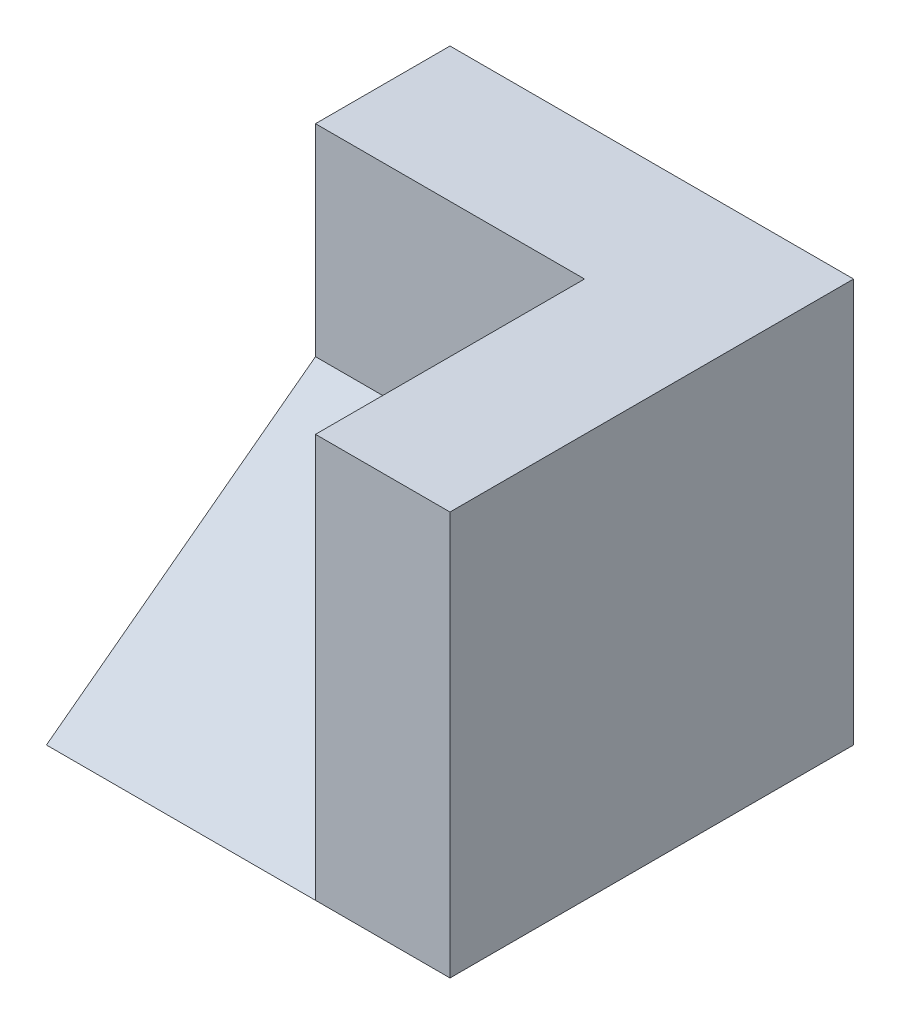
ISO-10303-21;
HEADER;
FILE_DESCRIPTION(('STEP AP214'),'2;1');
FILE_NAME('part.step','',(''),(''),'','','');
FILE_SCHEMA(('AUTOMOTIVE_DESIGN { 1 0 10303 214 1 1 1 1 }'));
ENDSEC;
DATA;
#1=APPLICATION_CONTEXT('core data for automotive mechanical design processes');
#2=APPLICATION_PROTOCOL_DEFINITION('international standard','automotive_design',2000,#1);
#3=PRODUCT_CONTEXT('',#1,'mechanical');
#4=PRODUCT('Part','Part','',(#3));
#5=PRODUCT_RELATED_PRODUCT_CATEGORY('part','',(#4));
#6=PRODUCT_DEFINITION_FORMATION('','',#4);
#7=PRODUCT_DEFINITION_CONTEXT('part definition',#1,'design');
#8=PRODUCT_DEFINITION('design','',#6,#7);
#9=PRODUCT_DEFINITION_SHAPE('','',#8);
#10=(LENGTH_UNIT() NAMED_UNIT(*) SI_UNIT(.MILLI.,.METRE.));
#11=(NAMED_UNIT(*) PLANE_ANGLE_UNIT() SI_UNIT($,.RADIAN.));
#12=(NAMED_UNIT(*) SI_UNIT($,.STERADIAN.) SOLID_ANGLE_UNIT());
#13=UNCERTAINTY_MEASURE_WITH_UNIT(LENGTH_MEASURE(1.E-05),#10,'distance_accuracy_value','');
#14=(GEOMETRIC_REPRESENTATION_CONTEXT(3) GLOBAL_UNCERTAINTY_ASSIGNED_CONTEXT((#13)) GLOBAL_UNIT_ASSIGNED_CONTEXT((#10,
#11,#12)) REPRESENTATION_CONTEXT('',''));
#15=CARTESIAN_POINT('',(0.,0.,0.));
#16=DIRECTION('',(0.,0.,1.));
#17=DIRECTION('',(1.,0.,0.));
#18=AXIS2_PLACEMENT_3D('',#15,#16,#17);
#19=CARTESIAN_POINT('',(0.,0.,-40.));
#20=DIRECTION('',(0.,0.,-1.));
#21=DIRECTION('',(-1.,0.,0.));
#22=AXIS2_PLACEMENT_3D('',#19,#20,#21);
#23=PLANE('',#22);
#24=DIRECTION('',(1.,0.,0.));
#25=VECTOR('',#24,1.);
#26=CARTESIAN_POINT('',(0.,30.,-40.));
#27=LINE('',#26,#25);
#28=CARTESIAN_POINT('',(0.,30.,-40.));
#29=VERTEX_POINT('',#28);
#30=CARTESIAN_POINT('',(40.,30.,-40.));
#31=VERTEX_POINT('',#30);
#32=EDGE_CURVE('E113',#29,#31,#27,.T.);
#33=ORIENTED_EDGE('',*,*,#32,.T.);
#34=DIRECTION('',(0.,1.,0.));
#35=VECTOR('',#34,1.);
#36=CARTESIAN_POINT('',(40.,0.,-40.));
#37=LINE('',#36,#35);
#38=CARTESIAN_POINT('',(40.,60.,-40.));
#39=VERTEX_POINT('',#38);
#40=EDGE_CURVE('E126',#31,#39,#37,.T.);
#41=ORIENTED_EDGE('',*,*,#40,.T.);
#42=DIRECTION('',(-1.,0.,0.));
#43=VECTOR('',#42,1.);
#44=CARTESIAN_POINT('',(0.,60.,-40.));
#45=LINE('',#44,#43);
#46=CARTESIAN_POINT('',(0.,60.,-40.));
#47=VERTEX_POINT('',#46);
#48=EDGE_CURVE('E122',#39,#47,#45,.T.);
#49=ORIENTED_EDGE('',*,*,#48,.T.);
#50=DIRECTION('',(0.,1.,0.));
#51=VECTOR('',#50,1.);
#52=CARTESIAN_POINT('',(0.,0.,-40.));
#53=LINE('',#52,#51);
#54=EDGE_CURVE('E53',#29,#47,#53,.T.);
#55=ORIENTED_EDGE('',*,*,#54,.F.);
#56=EDGE_LOOP('',(#33,#41,#49,#55));
#57=FACE_BOUND('',#56,.T.);
#58=ADVANCED_FACE('F36',(#57),#23,.F.);
#59=CARTESIAN_POINT('',(40.,0.,-40.));
#60=DIRECTION('',(1.,0.,0.));
#61=DIRECTION('',(0.,0.,-1.));
#62=AXIS2_PLACEMENT_3D('',#59,#60,#61);
#63=PLANE('',#62);
#64=DIRECTION('',(0.,0.6,-0.8));
#65=VECTOR('',#64,1.);
#66=CARTESIAN_POINT('',(40.,30.,-40.));
#67=LINE('',#66,#65);
#68=CARTESIAN_POINT('',(40.,0.,0.));
#69=VERTEX_POINT('',#68);
#70=EDGE_CURVE('E61',#69,#31,#67,.T.);
#71=ORIENTED_EDGE('',*,*,#70,.F.);
#72=DIRECTION('',(0.,1.,0.));
#73=VECTOR('',#72,1.);
#74=CARTESIAN_POINT('',(40.,0.,0.));
#75=LINE('',#74,#73);
#76=CARTESIAN_POINT('',(40.,60.,0.));
#77=VERTEX_POINT('',#76);
#78=EDGE_CURVE('E124',#69,#77,#75,.T.);
#79=ORIENTED_EDGE('',*,*,#78,.T.);
#80=DIRECTION('',(0.,0.,-1.));
#81=VECTOR('',#80,1.);
#82=CARTESIAN_POINT('',(40.,60.,-40.));
#83=LINE('',#82,#81);
#84=EDGE_CURVE('E112',#77,#39,#83,.T.);
#85=ORIENTED_EDGE('',*,*,#84,.T.);
#86=ORIENTED_EDGE('',*,*,#40,.F.);
#87=EDGE_LOOP('',(#71,#79,#85,#86));
#88=FACE_BOUND('',#87,.T.);
#89=ADVANCED_FACE('F155',(#88),#63,.F.);
#90=CARTESIAN_POINT('',(0.,60.,-60.));
#91=DIRECTION('',(-1.,0.,0.));
#92=DIRECTION('',(0.,0.,1.));
#93=AXIS2_PLACEMENT_3D('',#90,#91,#92);
#94=PLANE('',#93);
#95=DIRECTION('',(0.,0.,1.));
#96=VECTOR('',#95,1.);
#97=CARTESIAN_POINT('',(0.,0.,-60.));
#98=LINE('',#97,#96);
#99=CARTESIAN_POINT('',(0.,0.,-60.));
#100=VERTEX_POINT('',#99);
#101=CARTESIAN_POINT('',(0.,0.,0.));
#102=VERTEX_POINT('',#101);
#103=EDGE_CURVE('E40',#100,#102,#98,.T.);
#104=ORIENTED_EDGE('',*,*,#103,.T.);
#105=DIRECTION('',(0.,0.6,-0.8));
#106=VECTOR('',#105,1.);
#107=CARTESIAN_POINT('',(0.,30.,-40.));
#108=LINE('',#107,#106);
#109=EDGE_CURVE('E96',#102,#29,#108,.T.);
#110=ORIENTED_EDGE('',*,*,#109,.T.);
#111=ORIENTED_EDGE('',*,*,#54,.T.);
#112=DIRECTION('',(0.,0.,1.));
#113=VECTOR('',#112,1.);
#114=CARTESIAN_POINT('',(0.,60.,-60.));
#115=LINE('',#114,#113);
#116=CARTESIAN_POINT('',(0.,60.,-60.));
#117=VERTEX_POINT('',#116);
#118=EDGE_CURVE('E11',#117,#47,#115,.T.);
#119=ORIENTED_EDGE('',*,*,#118,.F.);
#120=DIRECTION('',(0.,-1.,0.));
#121=VECTOR('',#120,1.);
#122=CARTESIAN_POINT('',(0.,60.,-60.));
#123=LINE('',#122,#121);
#124=EDGE_CURVE('E99',#117,#100,#123,.T.);
#125=ORIENTED_EDGE('',*,*,#124,.T.);
#126=EDGE_LOOP('',(#104,#110,#111,#119,#125));
#127=FACE_BOUND('',#126,.T.);
#128=ADVANCED_FACE('F38',(#127),#94,.T.);
#129=CARTESIAN_POINT('',(60.,60.,-60.));
#130=DIRECTION('',(0.,1.,0.));
#131=DIRECTION('',(-1.,0.,0.));
#132=AXIS2_PLACEMENT_3D('',#129,#130,#131);
#133=PLANE('',#132);
#134=ORIENTED_EDGE('',*,*,#48,.F.);
#135=ORIENTED_EDGE('',*,*,#84,.F.);
#136=DIRECTION('',(-1.,0.,0.));
#137=VECTOR('',#136,1.);
#138=CARTESIAN_POINT('',(60.,60.,0.));
#139=LINE('',#138,#137);
#140=CARTESIAN_POINT('',(60.,60.,0.));
#141=VERTEX_POINT('',#140);
#142=EDGE_CURVE('E131',#141,#77,#139,.T.);
#143=ORIENTED_EDGE('',*,*,#142,.F.);
#144=DIRECTION('',(0.,0.,1.));
#145=VECTOR('',#144,1.);
#146=CARTESIAN_POINT('',(60.,60.,-60.));
#147=LINE('',#146,#145);
#148=CARTESIAN_POINT('',(60.,60.,-60.));
#149=VERTEX_POINT('',#148);
#150=EDGE_CURVE('E45',#149,#141,#147,.T.);
#151=ORIENTED_EDGE('',*,*,#150,.F.);
#152=DIRECTION('',(-1.,0.,0.));
#153=VECTOR('',#152,1.);
#154=CARTESIAN_POINT('',(60.,60.,-60.));
#155=LINE('',#154,#153);
#156=EDGE_CURVE('E104',#149,#117,#155,.T.);
#157=ORIENTED_EDGE('',*,*,#156,.T.);
#158=ORIENTED_EDGE('',*,*,#118,.T.);
#159=EDGE_LOOP('',(#134,#135,#143,#151,#157,#158));
#160=FACE_BOUND('',#159,.T.);
#161=ADVANCED_FACE('F154',(#160),#133,.T.);
#162=CARTESIAN_POINT('',(60.,0.,-60.));
#163=DIRECTION('',(1.,0.,0.));
#164=DIRECTION('',(0.,1.,0.));
#165=AXIS2_PLACEMENT_3D('',#162,#163,#164);
#166=PLANE('',#165);
#167=DIRECTION('',(0.,1.,0.));
#168=VECTOR('',#167,1.);
#169=CARTESIAN_POINT('',(60.,0.,0.));
#170=LINE('',#169,#168);
#171=CARTESIAN_POINT('',(60.,0.,0.));
#172=VERTEX_POINT('',#171);
#173=EDGE_CURVE('E139',#172,#141,#170,.T.);
#174=ORIENTED_EDGE('',*,*,#173,.F.);
#175=DIRECTION('',(0.,0.,1.));
#176=VECTOR('',#175,1.);
#177=CARTESIAN_POINT('',(60.,0.,-60.));
#178=LINE('',#177,#176);
#179=CARTESIAN_POINT('',(60.,0.,-60.));
#180=VERTEX_POINT('',#179);
#181=EDGE_CURVE('E103',#180,#172,#178,.T.);
#182=ORIENTED_EDGE('',*,*,#181,.F.);
#183=DIRECTION('',(0.,1.,0.));
#184=VECTOR('',#183,1.);
#185=CARTESIAN_POINT('',(60.,0.,-60.));
#186=LINE('',#185,#184);
#187=EDGE_CURVE('E133',#180,#149,#186,.T.);
#188=ORIENTED_EDGE('',*,*,#187,.T.);
#189=ORIENTED_EDGE('',*,*,#150,.T.);
#190=EDGE_LOOP('',(#174,#182,#188,#189));
#191=FACE_BOUND('',#190,.T.);
#192=ADVANCED_FACE('F147',(#191),#166,.T.);
#193=CARTESIAN_POINT('',(0.,0.,-60.));
#194=DIRECTION('',(0.,-1.,0.));
#195=DIRECTION('',(0.,0.,-1.));
#196=AXIS2_PLACEMENT_3D('',#193,#194,#195);
#197=PLANE('',#196);
#198=DIRECTION('',(1.,0.,0.));
#199=VECTOR('',#198,1.);
#200=CARTESIAN_POINT('',(0.,0.,0.));
#201=LINE('',#200,#199);
#202=EDGE_CURVE('E107',#102,#69,#201,.T.);
#203=ORIENTED_EDGE('',*,*,#202,.F.);
#204=ORIENTED_EDGE('',*,*,#103,.F.);
#205=DIRECTION('',(1.,0.,0.));
#206=VECTOR('',#205,1.);
#207=CARTESIAN_POINT('',(0.,0.,-60.));
#208=LINE('',#207,#206);
#209=EDGE_CURVE('E130',#100,#180,#208,.T.);
#210=ORIENTED_EDGE('',*,*,#209,.T.);
#211=ORIENTED_EDGE('',*,*,#181,.T.);
#212=DIRECTION('',(1.,0.,0.));
#213=VECTOR('',#212,1.);
#214=CARTESIAN_POINT('',(0.,0.,0.));
#215=LINE('',#214,#213);
#216=EDGE_CURVE('E110',#69,#172,#215,.T.);
#217=ORIENTED_EDGE('',*,*,#216,.F.);
#218=EDGE_LOOP('',(#203,#204,#210,#211,#217));
#219=FACE_BOUND('',#218,.T.);
#220=ADVANCED_FACE('F108',(#219),#197,.T.);
#221=CARTESIAN_POINT('',(0.,0.,-60.));
#222=DIRECTION('',(0.,0.,1.));
#223=DIRECTION('',(1.,0.,0.));
#224=AXIS2_PLACEMENT_3D('',#221,#222,#223);
#225=PLANE('',#224);
#226=ORIENTED_EDGE('',*,*,#124,.F.);
#227=ORIENTED_EDGE('',*,*,#156,.F.);
#228=ORIENTED_EDGE('',*,*,#187,.F.);
#229=ORIENTED_EDGE('',*,*,#209,.F.);
#230=EDGE_LOOP('',(#226,#227,#228,#229));
#231=FACE_BOUND('',#230,.T.);
#232=ADVANCED_FACE('F164',(#231),#225,.F.);
#233=CARTESIAN_POINT('',(0.,0.,0.));
#234=DIRECTION('',(0.,0.,1.));
#235=DIRECTION('',(1.,0.,0.));
#236=AXIS2_PLACEMENT_3D('',#233,#234,#235);
#237=PLANE('',#236);
#238=ORIENTED_EDGE('',*,*,#78,.F.);
#239=ORIENTED_EDGE('',*,*,#216,.T.);
#240=ORIENTED_EDGE('',*,*,#173,.T.);
#241=ORIENTED_EDGE('',*,*,#142,.T.);
#242=EDGE_LOOP('',(#238,#239,#240,#241));
#243=FACE_BOUND('',#242,.T.);
#244=ADVANCED_FACE('F150',(#243),#237,.T.);
#245=CARTESIAN_POINT('',(0.,30.,-40.));
#246=DIRECTION('',(0.,-0.8,-0.6));
#247=DIRECTION('',(0.,0.6,-0.8));
#248=AXIS2_PLACEMENT_3D('',#245,#246,#247);
#249=PLANE('',#248);
#250=ORIENTED_EDGE('',*,*,#70,.T.);
#251=ORIENTED_EDGE('',*,*,#32,.F.);
#252=ORIENTED_EDGE('',*,*,#109,.F.);
#253=ORIENTED_EDGE('',*,*,#202,.T.);
#254=EDGE_LOOP('',(#250,#251,#252,#253));
#255=FACE_BOUND('',#254,.T.);
#256=ADVANCED_FACE('F115',(#255),#249,.F.);
#257=CLOSED_SHELL('',(#58,#89,#128,#161,#192,#220,#232,#244,#256));
#258=MANIFOLD_SOLID_BREP('B2',#257);
#259=ADVANCED_BREP_SHAPE_REPRESENTATION('',(#18,#258),#14);
#260=SHAPE_DEFINITION_REPRESENTATION(#9,#259);
ENDSEC;
END-ISO-10303-21;
